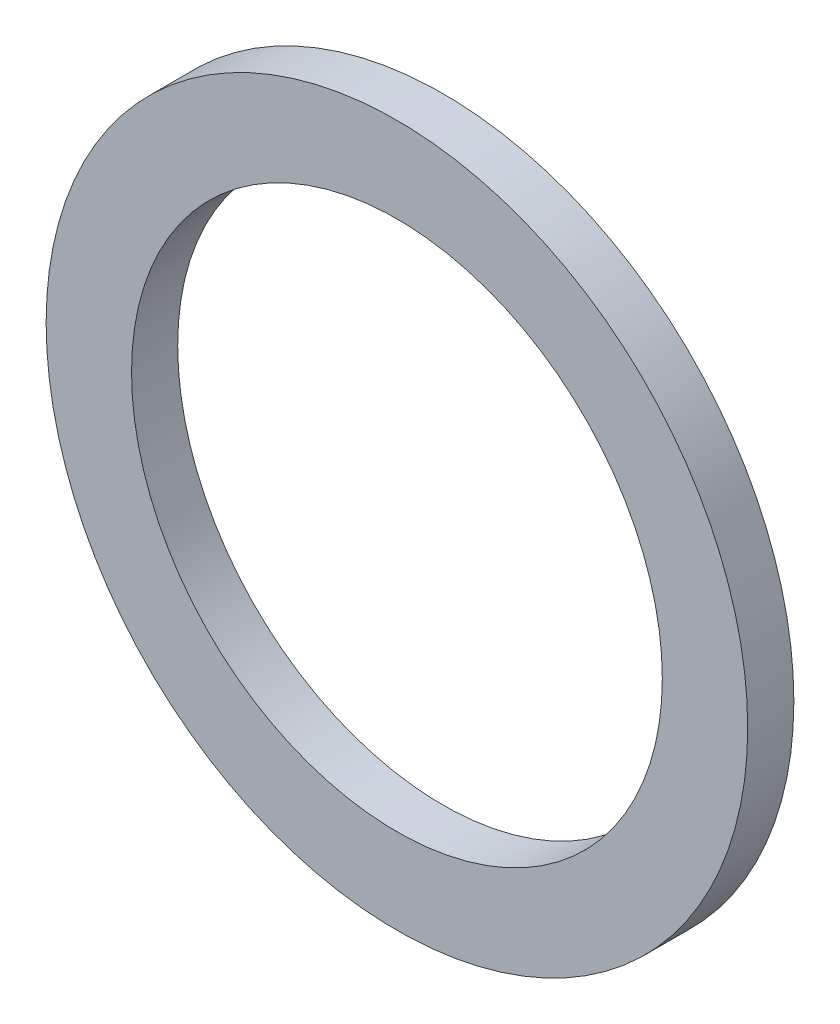
ISO-10303-21;
HEADER;
FILE_DESCRIPTION(('STEP AP214'),'2;1');
FILE_NAME('part.step','',(''),(''),'','','');
FILE_SCHEMA(('AUTOMOTIVE_DESIGN { 1 0 10303 214 1 1 1 1 }'));
ENDSEC;
DATA;
#1=APPLICATION_CONTEXT('core data for automotive mechanical design processes');
#2=APPLICATION_PROTOCOL_DEFINITION('international standard','automotive_design',2000,#1);
#3=PRODUCT_CONTEXT('',#1,'mechanical');
#4=PRODUCT('Part','Part','',(#3));
#5=PRODUCT_RELATED_PRODUCT_CATEGORY('part','',(#4));
#6=PRODUCT_DEFINITION_FORMATION('','',#4);
#7=PRODUCT_DEFINITION_CONTEXT('part definition',#1,'design');
#8=PRODUCT_DEFINITION('design','',#6,#7);
#9=PRODUCT_DEFINITION_SHAPE('','',#8);
#10=(LENGTH_UNIT() NAMED_UNIT(*) SI_UNIT(.MILLI.,.METRE.));
#11=(NAMED_UNIT(*) PLANE_ANGLE_UNIT() SI_UNIT($,.RADIAN.));
#12=(NAMED_UNIT(*) SI_UNIT($,.STERADIAN.) SOLID_ANGLE_UNIT());
#13=UNCERTAINTY_MEASURE_WITH_UNIT(LENGTH_MEASURE(1.E-05),#10,'distance_accuracy_value','');
#14=(GEOMETRIC_REPRESENTATION_CONTEXT(3) GLOBAL_UNCERTAINTY_ASSIGNED_CONTEXT((#13)) GLOBAL_UNIT_ASSIGNED_CONTEXT((#10,
#11,#12)) REPRESENTATION_CONTEXT('',''));
#15=CARTESIAN_POINT('',(0.,0.,0.));
#16=DIRECTION('',(0.,0.,1.));
#17=DIRECTION('',(1.,0.,0.));
#18=AXIS2_PLACEMENT_3D('',#15,#16,#17);
#19=CARTESIAN_POINT('',(0.,0.,150.));
#20=DIRECTION('',(0.,0.,1.));
#21=DIRECTION('',(1.,0.,0.));
#22=AXIS2_PLACEMENT_3D('',#19,#20,#21);
#23=CYLINDRICAL_SURFACE('',#22,5.75);
#24=CARTESIAN_POINT('',(0.,0.,46.));
#25=DIRECTION('',(0.,0.,1.));
#26=DIRECTION('',(1.,0.,0.));
#27=AXIS2_PLACEMENT_3D('',#24,#25,#26);
#28=CIRCLE('',#27,5.75);
#29=CARTESIAN_POINT('',(5.75,0.,46.));
#30=VERTEX_POINT('',#29);
#31=EDGE_CURVE('E53',#30,#30,#28,.T.);
#32=ORIENTED_EDGE('',*,*,#31,.T.);
#33=EDGE_LOOP('',(#32));
#34=FACE_BOUND('',#33,.T.);
#35=CARTESIAN_POINT('',(0.,0.,45.));
#36=DIRECTION('',(0.,0.,1.));
#37=DIRECTION('',(1.,0.,0.));
#38=AXIS2_PLACEMENT_3D('',#35,#36,#37);
#39=CIRCLE('',#38,5.75);
#40=CARTESIAN_POINT('',(5.75,0.,45.));
#41=VERTEX_POINT('',#40);
#42=EDGE_CURVE('E10',#41,#41,#39,.T.);
#43=ORIENTED_EDGE('',*,*,#42,.F.);
#44=EDGE_LOOP('',(#43));
#45=FACE_BOUND('',#44,.T.);
#46=ADVANCED_FACE('F34',(#34,#45),#23,.F.);
#47=CARTESIAN_POINT('',(5.75,0.,45.));
#48=DIRECTION('',(0.,0.,-1.));
#49=DIRECTION('',(-1.,0.,0.));
#50=AXIS2_PLACEMENT_3D('',#47,#48,#49);
#51=PLANE('',#50);
#52=ORIENTED_EDGE('',*,*,#42,.T.);
#53=EDGE_LOOP('',(#52));
#54=FACE_BOUND('',#53,.T.);
#55=CARTESIAN_POINT('',(0.,0.,45.));
#56=DIRECTION('',(0.,0.,1.));
#57=DIRECTION('',(1.,0.,0.));
#58=AXIS2_PLACEMENT_3D('',#55,#56,#57);
#59=CIRCLE('',#58,7.6);
#60=CARTESIAN_POINT('',(7.6,0.,45.));
#61=VERTEX_POINT('',#60);
#62=EDGE_CURVE('E45',#61,#61,#59,.T.);
#63=ORIENTED_EDGE('',*,*,#62,.F.);
#64=EDGE_LOOP('',(#63));
#65=FACE_BOUND('',#64,.T.);
#66=ADVANCED_FACE('F71',(#54,#65),#51,.T.);
#67=CARTESIAN_POINT('',(0.,0.,150.));
#68=DIRECTION('',(0.,0.,1.));
#69=DIRECTION('',(1.,0.,0.));
#70=AXIS2_PLACEMENT_3D('',#67,#68,#69);
#71=CYLINDRICAL_SURFACE('',#70,7.6);
#72=ORIENTED_EDGE('',*,*,#62,.T.);
#73=EDGE_LOOP('',(#72));
#74=FACE_BOUND('',#73,.T.);
#75=CARTESIAN_POINT('',(0.,0.,46.));
#76=DIRECTION('',(0.,0.,1.));
#77=DIRECTION('',(1.,0.,0.));
#78=AXIS2_PLACEMENT_3D('',#75,#76,#77);
#79=CIRCLE('',#78,7.6);
#80=CARTESIAN_POINT('',(7.6,0.,46.));
#81=VERTEX_POINT('',#80);
#82=EDGE_CURVE('E48',#81,#81,#79,.T.);
#83=ORIENTED_EDGE('',*,*,#82,.F.);
#84=EDGE_LOOP('',(#83));
#85=FACE_BOUND('',#84,.T.);
#86=ADVANCED_FACE('F67',(#74,#85),#71,.T.);
#87=CARTESIAN_POINT('',(7.6,0.,46.));
#88=DIRECTION('',(0.,0.,1.));
#89=DIRECTION('',(1.,0.,0.));
#90=AXIS2_PLACEMENT_3D('',#87,#88,#89);
#91=PLANE('',#90);
#92=ORIENTED_EDGE('',*,*,#82,.T.);
#93=EDGE_LOOP('',(#92));
#94=FACE_BOUND('',#93,.T.);
#95=ORIENTED_EDGE('',*,*,#31,.F.);
#96=EDGE_LOOP('',(#95));
#97=FACE_BOUND('',#96,.T.);
#98=ADVANCED_FACE('F61',(#94,#97),#91,.T.);
#99=CLOSED_SHELL('',(#46,#66,#86,#98));
#100=MANIFOLD_SOLID_BREP('B2',#99);
#101=ADVANCED_BREP_SHAPE_REPRESENTATION('',(#18,#100),#14);
#102=SHAPE_DEFINITION_REPRESENTATION(#9,#101);
ENDSEC;
END-ISO-10303-21;
